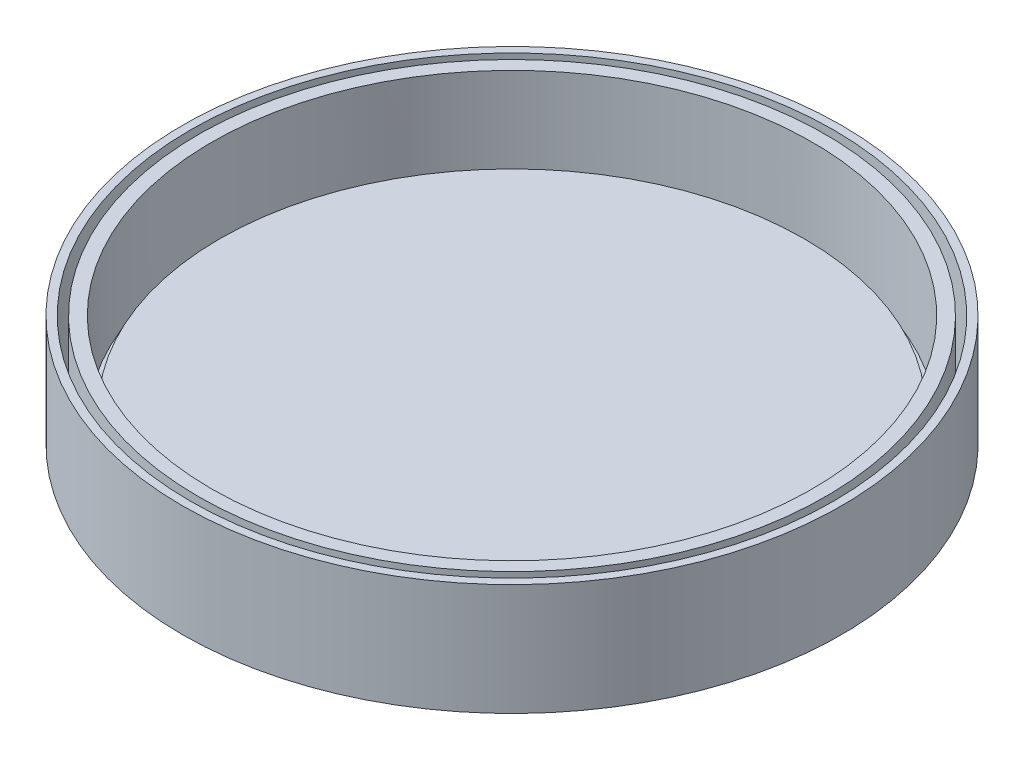
ISO-10303-21;
HEADER;
FILE_DESCRIPTION(('STEP AP214'),'2;1');
FILE_NAME('part.step','',(''),(''),'','','');
FILE_SCHEMA(('AUTOMOTIVE_DESIGN { 1 0 10303 214 1 1 1 1 }'));
ENDSEC;
DATA;
#1=APPLICATION_CONTEXT('core data for automotive mechanical design processes');
#2=APPLICATION_PROTOCOL_DEFINITION('international standard','automotive_design',2000,#1);
#3=PRODUCT_CONTEXT('',#1,'mechanical');
#4=PRODUCT('Part','Part','',(#3));
#5=PRODUCT_RELATED_PRODUCT_CATEGORY('part','',(#4));
#6=PRODUCT_DEFINITION_FORMATION('','',#4);
#7=PRODUCT_DEFINITION_CONTEXT('part definition',#1,'design');
#8=PRODUCT_DEFINITION('design','',#6,#7);
#9=PRODUCT_DEFINITION_SHAPE('','',#8);
#10=(LENGTH_UNIT() NAMED_UNIT(*) SI_UNIT(.MILLI.,.METRE.));
#11=(NAMED_UNIT(*) PLANE_ANGLE_UNIT() SI_UNIT($,.RADIAN.));
#12=(NAMED_UNIT(*) SI_UNIT($,.STERADIAN.) SOLID_ANGLE_UNIT());
#13=UNCERTAINTY_MEASURE_WITH_UNIT(LENGTH_MEASURE(1.E-05),#10,'distance_accuracy_value','');
#14=(GEOMETRIC_REPRESENTATION_CONTEXT(3) GLOBAL_UNCERTAINTY_ASSIGNED_CONTEXT((#13)) GLOBAL_UNIT_ASSIGNED_CONTEXT((#10,
#11,#12)) REPRESENTATION_CONTEXT('',''));
#15=CARTESIAN_POINT('',(0.,0.,0.));
#16=DIRECTION('',(0.,0.,1.));
#17=DIRECTION('',(1.,0.,0.));
#18=AXIS2_PLACEMENT_3D('',#15,#16,#17);
#19=CARTESIAN_POINT('',(0.,-1.,0.));
#20=DIRECTION('',(0.,1.,0.));
#21=DIRECTION('',(0.,0.,1.));
#22=AXIS2_PLACEMENT_3D('',#19,#20,#21);
#23=CYLINDRICAL_SURFACE('',#22,56.5);
#24=CARTESIAN_POINT('',(0.,20.,0.));
#25=DIRECTION('',(0.,1.,0.));
#26=DIRECTION('',(0.,0.,1.));
#27=AXIS2_PLACEMENT_3D('',#24,#25,#26);
#28=CIRCLE('',#27,56.5);
#29=CARTESIAN_POINT('',(0.,20.,56.5));
#30=VERTEX_POINT('',#29);
#31=EDGE_CURVE('E166',#30,#30,#28,.T.);
#32=ORIENTED_EDGE('',*,*,#31,.T.);
#33=EDGE_LOOP('',(#32));
#34=FACE_BOUND('',#33,.T.);
#35=CARTESIAN_POINT('',(0.,2.08074636737736,0.));
#36=DIRECTION('',(0.,-1.,0.));
#37=DIRECTION('',(0.,0.,-1.));
#38=AXIS2_PLACEMENT_3D('',#35,#36,#37);
#39=CIRCLE('',#38,56.5);
#40=CARTESIAN_POINT('',(0.,2.08074636737736,-56.5));
#41=VERTEX_POINT('',#40);
#42=EDGE_CURVE('E12',#41,#41,#39,.F.);
#43=ORIENTED_EDGE('',*,*,#42,.F.);
#44=EDGE_LOOP('',(#43));
#45=FACE_BOUND('',#44,.T.);
#46=ADVANCED_FACE('F159',(#34,#45),#23,.F.);
#47=CARTESIAN_POINT('',(0.,-1.,0.));
#48=DIRECTION('',(0.,1.,0.));
#49=DIRECTION('',(0.,0.,1.));
#50=AXIS2_PLACEMENT_3D('',#47,#48,#49);
#51=CYLINDRICAL_SURFACE('',#50,59.);
#52=CARTESIAN_POINT('',(0.,-1.,0.));
#53=DIRECTION('',(0.,1.,0.));
#54=DIRECTION('',(0.,0.,1.));
#55=AXIS2_PLACEMENT_3D('',#52,#53,#54);
#56=CIRCLE('',#55,59.);
#57=CARTESIAN_POINT('',(0.,-1.,59.));
#58=VERTEX_POINT('',#57);
#59=EDGE_CURVE('E174',#58,#58,#56,.T.);
#60=ORIENTED_EDGE('',*,*,#59,.T.);
#61=EDGE_LOOP('',(#60));
#62=FACE_BOUND('',#61,.T.);
#63=CARTESIAN_POINT('',(0.,20.,0.));
#64=DIRECTION('',(0.,1.,0.));
#65=DIRECTION('',(0.,0.,1.));
#66=AXIS2_PLACEMENT_3D('',#63,#64,#65);
#67=CIRCLE('',#66,59.);
#68=CARTESIAN_POINT('',(0.,20.,59.));
#69=VERTEX_POINT('',#68);
#70=EDGE_CURVE('E170',#69,#69,#67,.T.);
#71=ORIENTED_EDGE('',*,*,#70,.F.);
#72=EDGE_LOOP('',(#71));
#73=FACE_BOUND('',#72,.T.);
#74=ADVANCED_FACE('F204',(#62,#73),#51,.T.);
#75=CARTESIAN_POINT('',(0.,-1.,0.));
#76=DIRECTION('',(0.,1.,0.));
#77=DIRECTION('',(0.,0.,1.));
#78=AXIS2_PLACEMENT_3D('',#75,#76,#77);
#79=PLANE('',#78);
#80=ORIENTED_EDGE('',*,*,#59,.F.);
#81=EDGE_LOOP('',(#80));
#82=FACE_BOUND('',#81,.T.);
#83=ADVANCED_FACE('F200',(#82),#79,.F.);
#84=CARTESIAN_POINT('',(0.,20.,0.));
#85=DIRECTION('',(0.,1.,0.));
#86=DIRECTION('',(0.,0.,1.));
#87=AXIS2_PLACEMENT_3D('',#84,#85,#86);
#88=PLANE('',#87);
#89=ORIENTED_EDGE('',*,*,#70,.T.);
#90=EDGE_LOOP('',(#89));
#91=FACE_BOUND('',#90,.T.);
#92=ORIENTED_EDGE('',*,*,#31,.F.);
#93=EDGE_LOOP('',(#92));
#94=FACE_BOUND('',#93,.T.);
#95=ADVANCED_FACE('F161',(#91,#94),#88,.T.);
#96=CARTESIAN_POINT('',(0.,2.08074636737736,0.));
#97=DIRECTION('',(0.,-1.,0.));
#98=DIRECTION('',(0.,0.,-1.));
#99=AXIS2_PLACEMENT_3D('',#96,#97,#98);
#100=PLANE('',#99);
#101=CARTESIAN_POINT('',(0.,2.08074636737736,0.));
#102=DIRECTION('',(0.,-1.,0.));
#103=DIRECTION('',(0.,0.,-1.));
#104=AXIS2_PLACEMENT_3D('',#101,#102,#103);
#105=CIRCLE('',#104,55.);
#106=CARTESIAN_POINT('',(0.,2.08074636737736,-55.));
#107=VERTEX_POINT('',#106);
#108=EDGE_CURVE('E179',#107,#107,#105,.T.);
#109=ORIENTED_EDGE('',*,*,#108,.T.);
#110=EDGE_LOOP('',(#109));
#111=FACE_BOUND('',#110,.T.);
#112=ORIENTED_EDGE('',*,*,#42,.T.);
#113=EDGE_LOOP('',(#112));
#114=FACE_BOUND('',#113,.T.);
#115=ADVANCED_FACE('F191',(#111,#114),#100,.F.);
#116=CARTESIAN_POINT('',(0.,-1.,0.));
#117=DIRECTION('',(0.,1.,0.));
#118=DIRECTION('',(0.,0.,1.));
#119=AXIS2_PLACEMENT_3D('',#116,#117,#118);
#120=CYLINDRICAL_SURFACE('',#119,55.);
#121=CARTESIAN_POINT('',(0.,5.,0.));
#122=DIRECTION('',(0.,1.,0.));
#123=DIRECTION('',(0.,0.,1.));
#124=AXIS2_PLACEMENT_3D('',#121,#122,#123);
#125=CIRCLE('',#124,55.);
#126=CARTESIAN_POINT('',(0.,5.,55.));
#127=VERTEX_POINT('',#126);
#128=EDGE_CURVE('E182',#127,#127,#125,.T.);
#129=ORIENTED_EDGE('',*,*,#128,.F.);
#130=EDGE_LOOP('',(#129));
#131=FACE_BOUND('',#130,.T.);
#132=ORIENTED_EDGE('',*,*,#108,.F.);
#133=EDGE_LOOP('',(#132));
#134=FACE_BOUND('',#133,.T.);
#135=ADVANCED_FACE('F188',(#131,#134),#120,.T.);
#136=CARTESIAN_POINT('',(0.,5.,0.));
#137=DIRECTION('',(0.,1.,0.));
#138=DIRECTION('',(0.,0.,1.));
#139=AXIS2_PLACEMENT_3D('',#136,#137,#138);
#140=PLANE('',#139);
#141=ORIENTED_EDGE('',*,*,#128,.T.);
#142=EDGE_LOOP('',(#141));
#143=FACE_BOUND('',#142,.T.);
#144=ADVANCED_FACE('F186',(#143),#140,.T.);
#145=CLOSED_SHELL('',(#46,#74,#83,#95,#115,#135,#144));
#146=MANIFOLD_SOLID_BREP('B2',#145);
#147=CARTESIAN_POINT('',(0.,-1.,0.));
#148=DIRECTION('',(0.,1.,0.));
#149=DIRECTION('',(0.,0.,1.));
#150=AXIS2_PLACEMENT_3D('',#147,#148,#149);
#151=CYLINDRICAL_SURFACE('',#150,62.);
#152=CARTESIAN_POINT('',(0.,-1.,0.));
#153=DIRECTION('',(0.,1.,0.));
#154=DIRECTION('',(0.,0.,1.));
#155=AXIS2_PLACEMENT_3D('',#152,#153,#154);
#156=CIRCLE('',#155,62.);
#157=CARTESIAN_POINT('',(0.,-1.,62.));
#158=VERTEX_POINT('',#157);
#159=EDGE_CURVE('E158',#158,#158,#156,.T.);
#160=ORIENTED_EDGE('',*,*,#159,.T.);
#161=EDGE_LOOP('',(#160));
#162=FACE_BOUND('',#161,.T.);
#163=CARTESIAN_POINT('',(0.,20.,0.));
#164=DIRECTION('',(0.,1.,0.));
#165=DIRECTION('',(0.,0.,1.));
#166=AXIS2_PLACEMENT_3D('',#163,#164,#165);
#167=CIRCLE('',#166,62.);
#168=CARTESIAN_POINT('',(0.,20.,62.));
#169=VERTEX_POINT('',#168);
#170=EDGE_CURVE('E276',#169,#169,#167,.T.);
#171=ORIENTED_EDGE('',*,*,#170,.F.);
#172=EDGE_LOOP('',(#171));
#173=FACE_BOUND('',#172,.T.);
#174=ADVANCED_FACE('F266',(#162,#173),#151,.T.);
#175=CARTESIAN_POINT('',(0.,-1.,0.));
#176=DIRECTION('',(0.,1.,0.));
#177=DIRECTION('',(0.,0.,1.));
#178=AXIS2_PLACEMENT_3D('',#175,#176,#177);
#179=PLANE('',#178);
#180=CARTESIAN_POINT('',(0.,-1.,0.));
#181=DIRECTION('',(0.,1.,0.));
#182=DIRECTION('',(0.,0.,1.));
#183=AXIS2_PLACEMENT_3D('',#180,#181,#182);
#184=CIRCLE('',#183,60.5);
#185=CARTESIAN_POINT('',(0.,-1.,60.5));
#186=VERTEX_POINT('',#185);
#187=EDGE_CURVE('E272',#186,#186,#184,.T.);
#188=ORIENTED_EDGE('',*,*,#187,.T.);
#189=EDGE_LOOP('',(#188));
#190=FACE_BOUND('',#189,.T.);
#191=ORIENTED_EDGE('',*,*,#159,.F.);
#192=EDGE_LOOP('',(#191));
#193=FACE_BOUND('',#192,.T.);
#194=ADVANCED_FACE('F295',(#190,#193),#179,.F.);
#195=CARTESIAN_POINT('',(0.,-1.,0.));
#196=DIRECTION('',(0.,1.,0.));
#197=DIRECTION('',(0.,0.,1.));
#198=AXIS2_PLACEMENT_3D('',#195,#196,#197);
#199=CYLINDRICAL_SURFACE('',#198,60.5);
#200=ORIENTED_EDGE('',*,*,#187,.F.);
#201=EDGE_LOOP('',(#200));
#202=FACE_BOUND('',#201,.T.);
#203=CARTESIAN_POINT('',(0.,20.,0.));
#204=DIRECTION('',(0.,1.,0.));
#205=DIRECTION('',(0.,0.,1.));
#206=AXIS2_PLACEMENT_3D('',#203,#204,#205);
#207=CIRCLE('',#206,60.5);
#208=CARTESIAN_POINT('',(0.,20.,60.5));
#209=VERTEX_POINT('',#208);
#210=EDGE_CURVE('E280',#209,#209,#207,.T.);
#211=ORIENTED_EDGE('',*,*,#210,.T.);
#212=EDGE_LOOP('',(#211));
#213=FACE_BOUND('',#212,.T.);
#214=ADVANCED_FACE('F286',(#202,#213),#199,.F.);
#215=CARTESIAN_POINT('',(0.,20.,0.));
#216=DIRECTION('',(0.,1.,0.));
#217=DIRECTION('',(0.,0.,1.));
#218=AXIS2_PLACEMENT_3D('',#215,#216,#217);
#219=PLANE('',#218);
#220=ORIENTED_EDGE('',*,*,#170,.T.);
#221=EDGE_LOOP('',(#220));
#222=FACE_BOUND('',#221,.T.);
#223=ORIENTED_EDGE('',*,*,#210,.F.);
#224=EDGE_LOOP('',(#223));
#225=FACE_BOUND('',#224,.T.);
#226=ADVANCED_FACE('F288',(#222,#225),#219,.T.);
#227=CLOSED_SHELL('',(#174,#194,#214,#226));
#228=MANIFOLD_SOLID_BREP('B7',#227);
#229=ADVANCED_BREP_SHAPE_REPRESENTATION('',(#18,#146,#228),#14);
#230=SHAPE_DEFINITION_REPRESENTATION(#9,#229);
ENDSEC;
END-ISO-10303-21;
